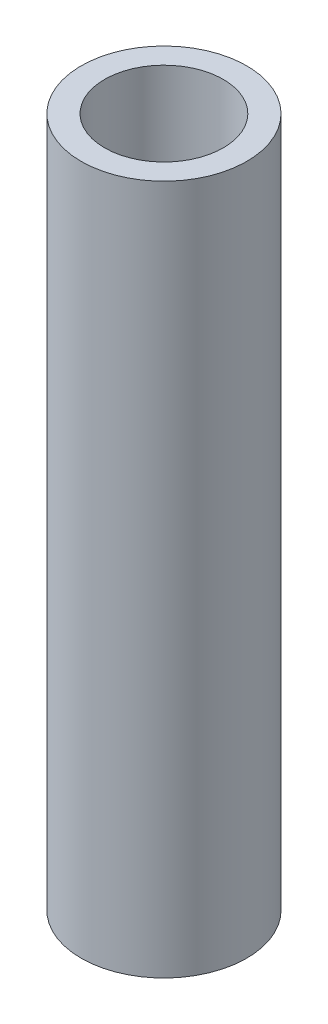
ISO-10303-21;
HEADER;
FILE_DESCRIPTION(('STEP AP214'),'2;1');
FILE_NAME('part.step','',(''),(''),'','','');
FILE_SCHEMA(('AUTOMOTIVE_DESIGN { 1 0 10303 214 1 1 1 1 }'));
ENDSEC;
DATA;
#1=APPLICATION_CONTEXT('core data for automotive mechanical design processes');
#2=APPLICATION_PROTOCOL_DEFINITION('international standard','automotive_design',2000,#1);
#3=PRODUCT_CONTEXT('',#1,'mechanical');
#4=PRODUCT('Part','Part','',(#3));
#5=PRODUCT_RELATED_PRODUCT_CATEGORY('part','',(#4));
#6=PRODUCT_DEFINITION_FORMATION('','',#4);
#7=PRODUCT_DEFINITION_CONTEXT('part definition',#1,'design');
#8=PRODUCT_DEFINITION('design','',#6,#7);
#9=PRODUCT_DEFINITION_SHAPE('','',#8);
#10=(LENGTH_UNIT() NAMED_UNIT(*) SI_UNIT(.MILLI.,.METRE.));
#11=(NAMED_UNIT(*) PLANE_ANGLE_UNIT() SI_UNIT($,.RADIAN.));
#12=(NAMED_UNIT(*) SI_UNIT($,.STERADIAN.) SOLID_ANGLE_UNIT());
#13=UNCERTAINTY_MEASURE_WITH_UNIT(LENGTH_MEASURE(1.E-05),#10,'distance_accuracy_value','');
#14=(GEOMETRIC_REPRESENTATION_CONTEXT(3) GLOBAL_UNCERTAINTY_ASSIGNED_CONTEXT((#13)) GLOBAL_UNIT_ASSIGNED_CONTEXT((#10,
#11,#12)) REPRESENTATION_CONTEXT('',''));
#15=CARTESIAN_POINT('',(0.,0.,0.));
#16=DIRECTION('',(0.,0.,1.));
#17=DIRECTION('',(1.,0.,0.));
#18=AXIS2_PLACEMENT_3D('',#15,#16,#17);
#19=CARTESIAN_POINT('',(0.,88.9,0.));
#20=DIRECTION('',(0.,1.,0.));
#21=DIRECTION('',(0.,0.,1.));
#22=AXIS2_PLACEMENT_3D('',#19,#20,#21);
#23=PLANE('',#22);
#24=CARTESIAN_POINT('',(0.,88.9,0.));
#25=DIRECTION('',(0.,1.,0.));
#26=DIRECTION('',(0.,0.,1.));
#27=AXIS2_PLACEMENT_3D('',#24,#25,#26);
#28=CIRCLE('',#27,10.668);
#29=CARTESIAN_POINT('',(0.,88.9,10.668));
#30=VERTEX_POINT('',#29);
#31=EDGE_CURVE('E10',#30,#30,#28,.T.);
#32=ORIENTED_EDGE('',*,*,#31,.T.);
#33=EDGE_LOOP('',(#32));
#34=FACE_BOUND('',#33,.T.);
#35=CARTESIAN_POINT('',(0.,88.9,0.));
#36=DIRECTION('',(0.,1.,0.));
#37=DIRECTION('',(0.,0.,1.));
#38=AXIS2_PLACEMENT_3D('',#35,#36,#37);
#39=CIRCLE('',#38,7.6454);
#40=CARTESIAN_POINT('',(0.,88.9,7.6454));
#41=VERTEX_POINT('',#40);
#42=EDGE_CURVE('E42',#41,#41,#39,.T.);
#43=ORIENTED_EDGE('',*,*,#42,.F.);
#44=EDGE_LOOP('',(#43));
#45=FACE_BOUND('',#44,.T.);
#46=ADVANCED_FACE('F31',(#34,#45),#23,.T.);
#47=CARTESIAN_POINT('',(0.,0.,0.));
#48=DIRECTION('',(0.,1.,0.));
#49=DIRECTION('',(0.,0.,1.));
#50=AXIS2_PLACEMENT_3D('',#47,#48,#49);
#51=PLANE('',#50);
#52=CARTESIAN_POINT('',(0.,0.,0.));
#53=DIRECTION('',(0.,1.,0.));
#54=DIRECTION('',(0.,0.,1.));
#55=AXIS2_PLACEMENT_3D('',#52,#53,#54);
#56=CIRCLE('',#55,10.668);
#57=CARTESIAN_POINT('',(0.,0.,10.668));
#58=VERTEX_POINT('',#57);
#59=EDGE_CURVE('E35',#58,#58,#56,.T.);
#60=ORIENTED_EDGE('',*,*,#59,.F.);
#61=EDGE_LOOP('',(#60));
#62=FACE_BOUND('',#61,.T.);
#63=CARTESIAN_POINT('',(0.,0.,0.));
#64=DIRECTION('',(0.,1.,0.));
#65=DIRECTION('',(0.,0.,1.));
#66=AXIS2_PLACEMENT_3D('',#63,#64,#65);
#67=CIRCLE('',#66,7.6454);
#68=CARTESIAN_POINT('',(0.,0.,7.6454));
#69=VERTEX_POINT('',#68);
#70=EDGE_CURVE('E44',#69,#69,#67,.T.);
#71=ORIENTED_EDGE('',*,*,#70,.T.);
#72=EDGE_LOOP('',(#71));
#73=FACE_BOUND('',#72,.T.);
#74=ADVANCED_FACE('F54',(#62,#73),#51,.F.);
#75=CARTESIAN_POINT('',(0.,88.9,0.));
#76=DIRECTION('',(0.,-1.,0.));
#77=DIRECTION('',(0.,0.,-1.));
#78=AXIS2_PLACEMENT_3D('',#75,#76,#77);
#79=CYLINDRICAL_SURFACE('',#78,10.668);
#80=ORIENTED_EDGE('',*,*,#31,.F.);
#81=EDGE_LOOP('',(#80));
#82=FACE_BOUND('',#81,.T.);
#83=ORIENTED_EDGE('',*,*,#59,.T.);
#84=EDGE_LOOP('',(#83));
#85=FACE_BOUND('',#84,.T.);
#86=ADVANCED_FACE('F33',(#82,#85),#79,.T.);
#87=CARTESIAN_POINT('',(0.,88.9,0.));
#88=DIRECTION('',(0.,-1.,0.));
#89=DIRECTION('',(0.,0.,-1.));
#90=AXIS2_PLACEMENT_3D('',#87,#88,#89);
#91=CYLINDRICAL_SURFACE('',#90,7.6454);
#92=ORIENTED_EDGE('',*,*,#42,.T.);
#93=EDGE_LOOP('',(#92));
#94=FACE_BOUND('',#93,.T.);
#95=ORIENTED_EDGE('',*,*,#70,.F.);
#96=EDGE_LOOP('',(#95));
#97=FACE_BOUND('',#96,.T.);
#98=ADVANCED_FACE('F50',(#94,#97),#91,.F.);
#99=CLOSED_SHELL('',(#46,#74,#86,#98));
#100=MANIFOLD_SOLID_BREP('B2',#99);
#101=ADVANCED_BREP_SHAPE_REPRESENTATION('',(#18,#100),#14);
#102=SHAPE_DEFINITION_REPRESENTATION(#9,#101);
ENDSEC;
END-ISO-10303-21;
